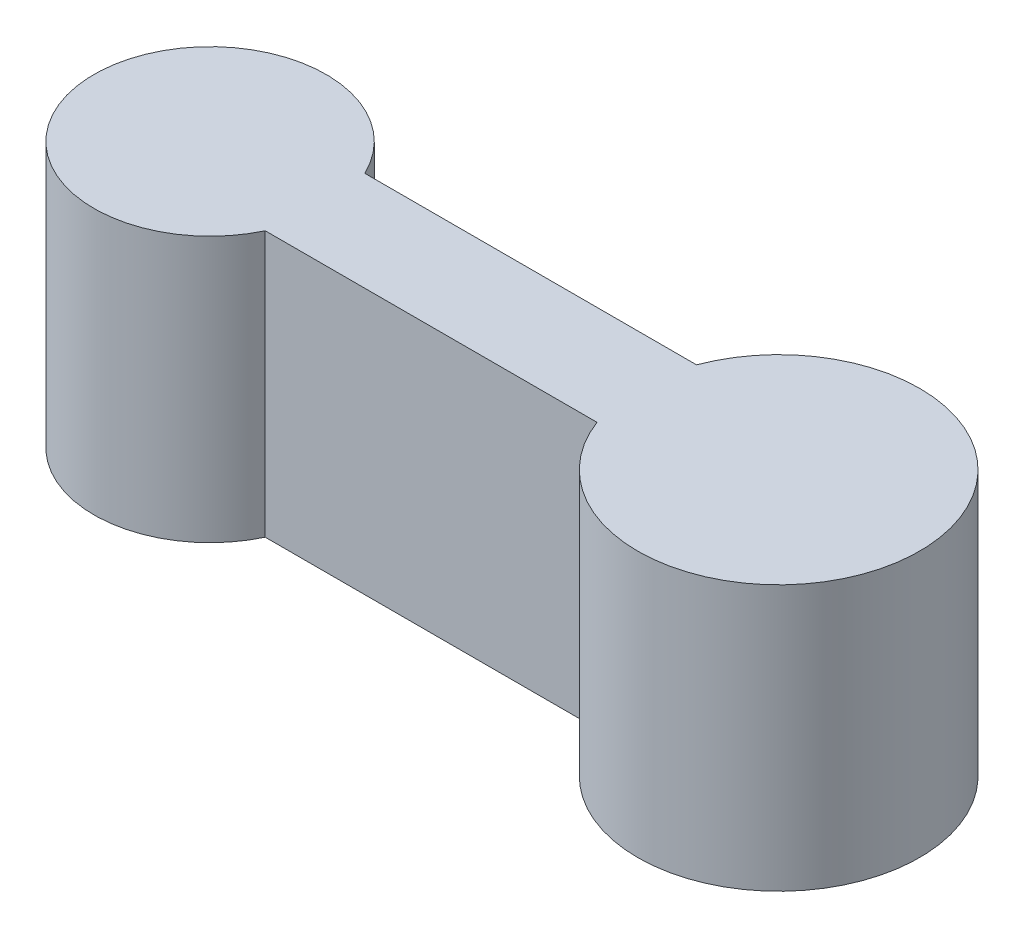
ISO-10303-21;
HEADER;
FILE_DESCRIPTION(('STEP AP214'),'2;1');
FILE_NAME('part.step','',(''),(''),'','','');
FILE_SCHEMA(('AUTOMOTIVE_DESIGN { 1 0 10303 214 1 1 1 1 }'));
ENDSEC;
DATA;
#1=APPLICATION_CONTEXT('core data for automotive mechanical design processes');
#2=APPLICATION_PROTOCOL_DEFINITION('international standard','automotive_design',2000,#1);
#3=PRODUCT_CONTEXT('',#1,'mechanical');
#4=PRODUCT('Part','Part','',(#3));
#5=PRODUCT_RELATED_PRODUCT_CATEGORY('part','',(#4));
#6=PRODUCT_DEFINITION_FORMATION('','',#4);
#7=PRODUCT_DEFINITION_CONTEXT('part definition',#1,'design');
#8=PRODUCT_DEFINITION('design','',#6,#7);
#9=PRODUCT_DEFINITION_SHAPE('','',#8);
#10=(LENGTH_UNIT() NAMED_UNIT(*) SI_UNIT(.MILLI.,.METRE.));
#11=(NAMED_UNIT(*) PLANE_ANGLE_UNIT() SI_UNIT($,.RADIAN.));
#12=(NAMED_UNIT(*) SI_UNIT($,.STERADIAN.) SOLID_ANGLE_UNIT());
#13=UNCERTAINTY_MEASURE_WITH_UNIT(LENGTH_MEASURE(1.E-05),#10,'distance_accuracy_value','');
#14=(GEOMETRIC_REPRESENTATION_CONTEXT(3) GLOBAL_UNCERTAINTY_ASSIGNED_CONTEXT((#13)) GLOBAL_UNIT_ASSIGNED_CONTEXT((#10,
#11,#12)) REPRESENTATION_CONTEXT('',''));
#15=CARTESIAN_POINT('',(0.,0.,0.));
#16=DIRECTION('',(0.,0.,1.));
#17=DIRECTION('',(1.,0.,0.));
#18=AXIS2_PLACEMENT_3D('',#15,#16,#17);
#19=CARTESIAN_POINT('',(-17.1387710903151,8.,0.));
#20=DIRECTION('',(0.,-1.,0.));
#21=DIRECTION('',(0.,0.,-1.));
#22=AXIS2_PLACEMENT_3D('',#19,#20,#21);
#23=CYLINDRICAL_SURFACE('',#22,3.5);
#24=CARTESIAN_POINT('',(-17.1387710903151,0.,0.));
#25=DIRECTION('',(0.,1.,0.));
#26=DIRECTION('',(0.,0.,1.));
#27=AXIS2_PLACEMENT_3D('',#24,#25,#26);
#28=CIRCLE('',#27,3.5);
#29=CARTESIAN_POINT('',(-13.9764934301467,0.,-1.5));
#30=VERTEX_POINT('',#29);
#31=CARTESIAN_POINT('',(-13.9764934301467,0.,1.5));
#32=VERTEX_POINT('',#31);
#33=EDGE_CURVE('E107',#30,#32,#28,.T.);
#34=ORIENTED_EDGE('',*,*,#33,.T.);
#35=DIRECTION('',(0.,-1.,0.));
#36=VECTOR('',#35,1.);
#37=CARTESIAN_POINT('',(-13.9764934301467,8.,1.5));
#38=LINE('',#37,#36);
#39=CARTESIAN_POINT('',(-13.9764934301467,8.,1.5));
#40=VERTEX_POINT('',#39);
#41=EDGE_CURVE('E11',#40,#32,#38,.T.);
#42=ORIENTED_EDGE('',*,*,#41,.F.);
#43=CARTESIAN_POINT('',(-17.1387710903151,8.,0.));
#44=DIRECTION('',(0.,1.,0.));
#45=DIRECTION('',(0.,0.,1.));
#46=AXIS2_PLACEMENT_3D('',#43,#44,#45);
#47=CIRCLE('',#46,3.5);
#48=CARTESIAN_POINT('',(-13.9764934301467,8.,-1.5));
#49=VERTEX_POINT('',#48);
#50=EDGE_CURVE('E91',#49,#40,#47,.T.);
#51=ORIENTED_EDGE('',*,*,#50,.F.);
#52=DIRECTION('',(0.,-1.,0.));
#53=VECTOR('',#52,1.);
#54=CARTESIAN_POINT('',(-13.9764934301467,8.,-1.5));
#55=LINE('',#54,#53);
#56=EDGE_CURVE('E103',#49,#30,#55,.T.);
#57=ORIENTED_EDGE('',*,*,#56,.T.);
#58=EDGE_LOOP('',(#34,#42,#51,#57));
#59=FACE_BOUND('',#58,.T.);
#60=ADVANCED_FACE('F39',(#59),#23,.T.);
#61=CARTESIAN_POINT('',(-13.9764934301467,8.,1.5));
#62=DIRECTION('',(0.,0.,-1.));
#63=DIRECTION('',(-1.,0.,0.));
#64=AXIS2_PLACEMENT_3D('',#61,#62,#63);
#65=PLANE('',#64);
#66=DIRECTION('',(1.,0.,0.));
#67=VECTOR('',#66,1.);
#68=CARTESIAN_POINT('',(-13.9764934301467,0.,1.5));
#69=LINE('',#68,#67);
#70=CARTESIAN_POINT('',(-3.97649343014672,0.,1.5));
#71=VERTEX_POINT('',#70);
#72=EDGE_CURVE('E96',#32,#71,#69,.T.);
#73=ORIENTED_EDGE('',*,*,#72,.T.);
#74=DIRECTION('',(0.,-1.,0.));
#75=VECTOR('',#74,1.);
#76=CARTESIAN_POINT('',(-3.97649343014672,8.,1.5));
#77=LINE('',#76,#75);
#78=CARTESIAN_POINT('',(-3.97649343014672,8.,1.5));
#79=VERTEX_POINT('',#78);
#80=EDGE_CURVE('E48',#79,#71,#77,.T.);
#81=ORIENTED_EDGE('',*,*,#80,.F.);
#82=DIRECTION('',(1.,0.,0.));
#83=VECTOR('',#82,1.);
#84=CARTESIAN_POINT('',(-13.9764934301467,8.,1.5));
#85=LINE('',#84,#83);
#86=EDGE_CURVE('E86',#40,#79,#85,.T.);
#87=ORIENTED_EDGE('',*,*,#86,.F.);
#88=ORIENTED_EDGE('',*,*,#41,.T.);
#89=EDGE_LOOP('',(#73,#81,#87,#88));
#90=FACE_BOUND('',#89,.T.);
#91=ADVANCED_FACE('F95',(#90),#65,.F.);
#92=CARTESIAN_POINT('',(0.,8.,0.));
#93=DIRECTION('',(0.,-1.,0.));
#94=DIRECTION('',(0.,0.,-1.));
#95=AXIS2_PLACEMENT_3D('',#92,#93,#94);
#96=CYLINDRICAL_SURFACE('',#95,4.25);
#97=CARTESIAN_POINT('',(0.,0.,0.));
#98=DIRECTION('',(0.,1.,0.));
#99=DIRECTION('',(0.,0.,1.));
#100=AXIS2_PLACEMENT_3D('',#97,#98,#99);
#101=CIRCLE('',#100,4.25);
#102=CARTESIAN_POINT('',(-3.97649343014672,0.,-1.5));
#103=VERTEX_POINT('',#102);
#104=EDGE_CURVE('E73',#71,#103,#101,.T.);
#105=ORIENTED_EDGE('',*,*,#104,.T.);
#106=DIRECTION('',(0.,-1.,0.));
#107=VECTOR('',#106,1.);
#108=CARTESIAN_POINT('',(-3.97649343014672,8.,-1.5));
#109=LINE('',#108,#107);
#110=CARTESIAN_POINT('',(-3.97649343014672,8.,-1.5));
#111=VERTEX_POINT('',#110);
#112=EDGE_CURVE('E98',#111,#103,#109,.T.);
#113=ORIENTED_EDGE('',*,*,#112,.F.);
#114=CARTESIAN_POINT('',(0.,8.,0.));
#115=DIRECTION('',(0.,1.,0.));
#116=DIRECTION('',(0.,0.,1.));
#117=AXIS2_PLACEMENT_3D('',#114,#115,#116);
#118=CIRCLE('',#117,4.25);
#119=EDGE_CURVE('E89',#79,#111,#118,.T.);
#120=ORIENTED_EDGE('',*,*,#119,.F.);
#121=ORIENTED_EDGE('',*,*,#80,.T.);
#122=EDGE_LOOP('',(#105,#113,#120,#121));
#123=FACE_BOUND('',#122,.T.);
#124=ADVANCED_FACE('F99',(#123),#96,.T.);
#125=CARTESIAN_POINT('',(-13.9764934301467,8.,-1.5));
#126=DIRECTION('',(0.,0.,1.));
#127=DIRECTION('',(1.,0.,0.));
#128=AXIS2_PLACEMENT_3D('',#125,#126,#127);
#129=PLANE('',#128);
#130=DIRECTION('',(-1.,0.,0.));
#131=VECTOR('',#130,1.);
#132=CARTESIAN_POINT('',(-13.9764934301467,0.,-1.5));
#133=LINE('',#132,#131);
#134=EDGE_CURVE('E79',#103,#30,#133,.T.);
#135=ORIENTED_EDGE('',*,*,#134,.T.);
#136=ORIENTED_EDGE('',*,*,#56,.F.);
#137=DIRECTION('',(-1.,0.,0.));
#138=VECTOR('',#137,1.);
#139=CARTESIAN_POINT('',(-13.9764934301467,8.,-1.5));
#140=LINE('',#139,#138);
#141=EDGE_CURVE('E56',#111,#49,#140,.T.);
#142=ORIENTED_EDGE('',*,*,#141,.F.);
#143=ORIENTED_EDGE('',*,*,#112,.T.);
#144=EDGE_LOOP('',(#135,#136,#142,#143));
#145=FACE_BOUND('',#144,.T.);
#146=ADVANCED_FACE('F120',(#145),#129,.F.);
#147=CARTESIAN_POINT('',(-17.1387710903151,8.,0.));
#148=DIRECTION('',(0.,1.,0.));
#149=DIRECTION('',(0.,0.,1.));
#150=AXIS2_PLACEMENT_3D('',#147,#148,#149);
#151=PLANE('',#150);
#152=ORIENTED_EDGE('',*,*,#50,.T.);
#153=ORIENTED_EDGE('',*,*,#86,.T.);
#154=ORIENTED_EDGE('',*,*,#119,.T.);
#155=ORIENTED_EDGE('',*,*,#141,.T.);
#156=EDGE_LOOP('',(#152,#153,#154,#155));
#157=FACE_BOUND('',#156,.T.);
#158=ADVANCED_FACE('F87',(#157),#151,.T.);
#159=CARTESIAN_POINT('',(-17.1387710903151,0.,0.));
#160=DIRECTION('',(0.,1.,0.));
#161=DIRECTION('',(0.,0.,1.));
#162=AXIS2_PLACEMENT_3D('',#159,#160,#161);
#163=PLANE('',#162);
#164=ORIENTED_EDGE('',*,*,#33,.F.);
#165=ORIENTED_EDGE('',*,*,#134,.F.);
#166=ORIENTED_EDGE('',*,*,#104,.F.);
#167=ORIENTED_EDGE('',*,*,#72,.F.);
#168=EDGE_LOOP('',(#164,#165,#166,#167));
#169=FACE_BOUND('',#168,.T.);
#170=ADVANCED_FACE('F123',(#169),#163,.F.);
#171=CLOSED_SHELL('',(#60,#91,#124,#146,#158,#170));
#172=MANIFOLD_SOLID_BREP('B2',#171);
#173=ADVANCED_BREP_SHAPE_REPRESENTATION('',(#18,#172),#14);
#174=SHAPE_DEFINITION_REPRESENTATION(#9,#173);
ENDSEC;
END-ISO-10303-21;
